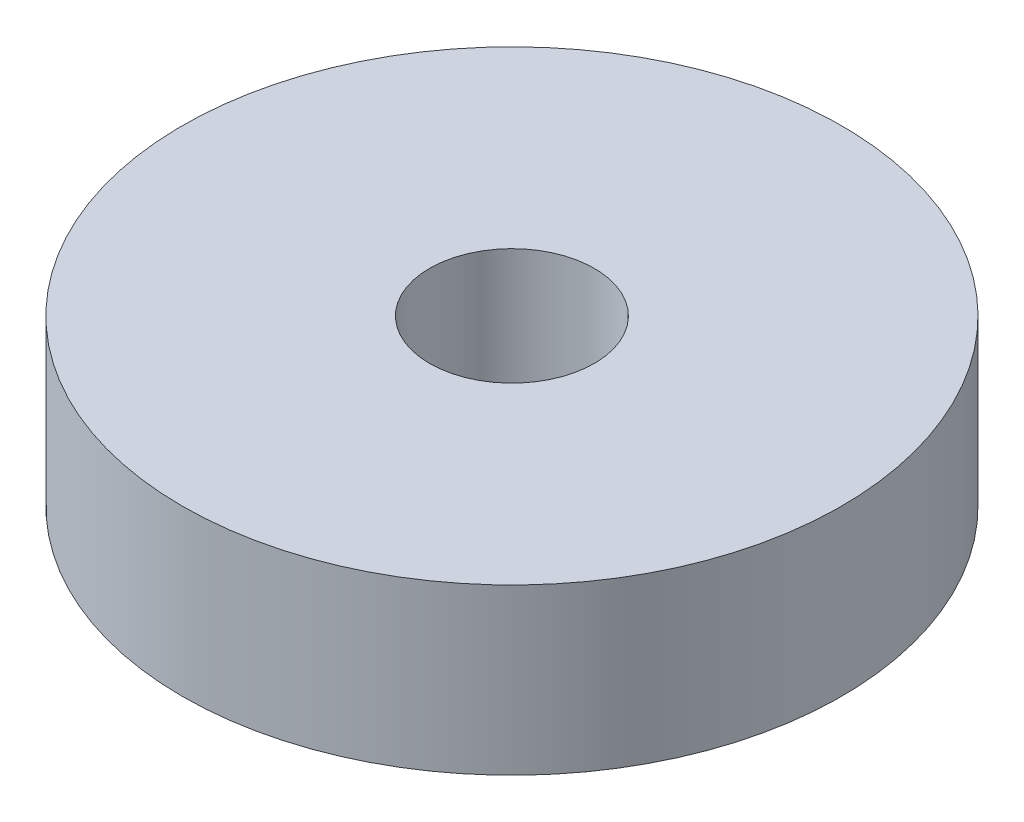
ISO-10303-21;
HEADER;
FILE_DESCRIPTION(('STEP AP214'),'2;1');
FILE_NAME('part.step','',(''),(''),'','','');
FILE_SCHEMA(('AUTOMOTIVE_DESIGN { 1 0 10303 214 1 1 1 1 }'));
ENDSEC;
DATA;
#1=APPLICATION_CONTEXT('core data for automotive mechanical design processes');
#2=APPLICATION_PROTOCOL_DEFINITION('international standard','automotive_design',2000,#1);
#3=PRODUCT_CONTEXT('',#1,'mechanical');
#4=PRODUCT('Part','Part','',(#3));
#5=PRODUCT_RELATED_PRODUCT_CATEGORY('part','',(#4));
#6=PRODUCT_DEFINITION_FORMATION('','',#4);
#7=PRODUCT_DEFINITION_CONTEXT('part definition',#1,'design');
#8=PRODUCT_DEFINITION('design','',#6,#7);
#9=PRODUCT_DEFINITION_SHAPE('','',#8);
#10=(LENGTH_UNIT() NAMED_UNIT(*) SI_UNIT(.MILLI.,.METRE.));
#11=(NAMED_UNIT(*) PLANE_ANGLE_UNIT() SI_UNIT($,.RADIAN.));
#12=(NAMED_UNIT(*) SI_UNIT($,.STERADIAN.) SOLID_ANGLE_UNIT());
#13=UNCERTAINTY_MEASURE_WITH_UNIT(LENGTH_MEASURE(1.E-05),#10,'distance_accuracy_value','');
#14=(GEOMETRIC_REPRESENTATION_CONTEXT(3) GLOBAL_UNCERTAINTY_ASSIGNED_CONTEXT((#13)) GLOBAL_UNIT_ASSIGNED_CONTEXT((#10,
#11,#12)) REPRESENTATION_CONTEXT('',''));
#15=CARTESIAN_POINT('',(0.,0.,0.));
#16=DIRECTION('',(0.,0.,1.));
#17=DIRECTION('',(1.,0.,0.));
#18=AXIS2_PLACEMENT_3D('',#15,#16,#17);
#19=CARTESIAN_POINT('',(0.,5.,0.));
#20=DIRECTION('',(0.,1.,0.));
#21=DIRECTION('',(0.,0.,1.));
#22=AXIS2_PLACEMENT_3D('',#19,#20,#21);
#23=PLANE('',#22);
#24=CARTESIAN_POINT('',(0.,5.,0.));
#25=DIRECTION('',(0.,1.,0.));
#26=DIRECTION('',(0.,0.,1.));
#27=AXIS2_PLACEMENT_3D('',#24,#25,#26);
#28=CIRCLE('',#27,10.);
#29=CARTESIAN_POINT('',(0.,5.,10.));
#30=VERTEX_POINT('',#29);
#31=EDGE_CURVE('E10',#30,#30,#28,.T.);
#32=ORIENTED_EDGE('',*,*,#31,.T.);
#33=EDGE_LOOP('',(#32));
#34=FACE_BOUND('',#33,.T.);
#35=CARTESIAN_POINT('',(0.,5.,0.));
#36=DIRECTION('',(0.,1.,0.));
#37=DIRECTION('',(0.,0.,1.));
#38=AXIS2_PLACEMENT_3D('',#35,#36,#37);
#39=CIRCLE('',#38,2.5);
#40=CARTESIAN_POINT('',(0.,5.,2.5));
#41=VERTEX_POINT('',#40);
#42=EDGE_CURVE('E50',#41,#41,#39,.T.);
#43=ORIENTED_EDGE('',*,*,#42,.F.);
#44=EDGE_LOOP('',(#43));
#45=FACE_BOUND('',#44,.T.);
#46=ADVANCED_FACE('F37',(#34,#45),#23,.T.);
#47=CARTESIAN_POINT('',(0.,0.,0.));
#48=DIRECTION('',(0.,1.,0.));
#49=DIRECTION('',(0.,0.,1.));
#50=AXIS2_PLACEMENT_3D('',#47,#48,#49);
#51=PLANE('',#50);
#52=CARTESIAN_POINT('',(0.,0.,0.));
#53=DIRECTION('',(0.,1.,0.));
#54=DIRECTION('',(0.,0.,1.));
#55=AXIS2_PLACEMENT_3D('',#52,#53,#54);
#56=CIRCLE('',#55,10.);
#57=CARTESIAN_POINT('',(0.,0.,10.));
#58=VERTEX_POINT('',#57);
#59=EDGE_CURVE('E41',#58,#58,#56,.T.);
#60=ORIENTED_EDGE('',*,*,#59,.F.);
#61=EDGE_LOOP('',(#60));
#62=FACE_BOUND('',#61,.T.);
#63=CARTESIAN_POINT('',(0.,0.,0.));
#64=DIRECTION('',(0.,1.,0.));
#65=DIRECTION('',(0.,0.,1.));
#66=AXIS2_PLACEMENT_3D('',#63,#64,#65);
#67=CIRCLE('',#66,2.5);
#68=CARTESIAN_POINT('',(0.,0.,2.5));
#69=VERTEX_POINT('',#68);
#70=EDGE_CURVE('E52',#69,#69,#67,.T.);
#71=ORIENTED_EDGE('',*,*,#70,.T.);
#72=EDGE_LOOP('',(#71));
#73=FACE_BOUND('',#72,.T.);
#74=ADVANCED_FACE('F64',(#62,#73),#51,.F.);
#75=CARTESIAN_POINT('',(0.,5.,0.));
#76=DIRECTION('',(0.,-1.,0.));
#77=DIRECTION('',(0.,0.,-1.));
#78=AXIS2_PLACEMENT_3D('',#75,#76,#77);
#79=CYLINDRICAL_SURFACE('',#78,10.);
#80=ORIENTED_EDGE('',*,*,#31,.F.);
#81=EDGE_LOOP('',(#80));
#82=FACE_BOUND('',#81,.T.);
#83=ORIENTED_EDGE('',*,*,#59,.T.);
#84=EDGE_LOOP('',(#83));
#85=FACE_BOUND('',#84,.T.);
#86=ADVANCED_FACE('F39',(#82,#85),#79,.T.);
#87=CARTESIAN_POINT('',(0.,5.,0.));
#88=DIRECTION('',(0.,-1.,0.));
#89=DIRECTION('',(0.,0.,-1.));
#90=AXIS2_PLACEMENT_3D('',#87,#88,#89);
#91=CYLINDRICAL_SURFACE('',#90,2.5);
#92=ORIENTED_EDGE('',*,*,#42,.T.);
#93=EDGE_LOOP('',(#92));
#94=FACE_BOUND('',#93,.T.);
#95=ORIENTED_EDGE('',*,*,#70,.F.);
#96=EDGE_LOOP('',(#95));
#97=FACE_BOUND('',#96,.T.);
#98=ADVANCED_FACE('F60',(#94,#97),#91,.F.);
#99=CLOSED_SHELL('',(#46,#74,#86,#98));
#100=MANIFOLD_SOLID_BREP('B2',#99);
#101=ADVANCED_BREP_SHAPE_REPRESENTATION('',(#18,#100),#14);
#102=SHAPE_DEFINITION_REPRESENTATION(#9,#101);
ENDSEC;
END-ISO-10303-21;
